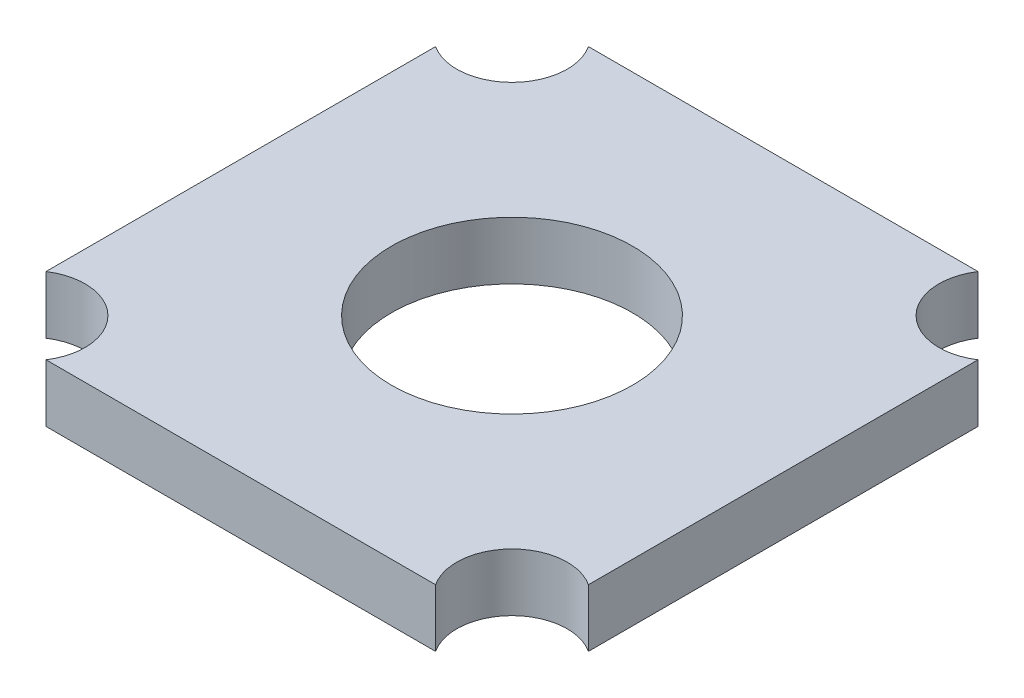
ISO-10303-21;
HEADER;
FILE_DESCRIPTION(('STEP AP214'),'2;1');
FILE_NAME('part.step','',(''),(''),'','','');
FILE_SCHEMA(('AUTOMOTIVE_DESIGN { 1 0 10303 214 1 1 1 1 }'));
ENDSEC;
DATA;
#1=APPLICATION_CONTEXT('core data for automotive mechanical design processes');
#2=APPLICATION_PROTOCOL_DEFINITION('international standard','automotive_design',2000,#1);
#3=PRODUCT_CONTEXT('',#1,'mechanical');
#4=PRODUCT('Part','Part','',(#3));
#5=PRODUCT_RELATED_PRODUCT_CATEGORY('part','',(#4));
#6=PRODUCT_DEFINITION_FORMATION('','',#4);
#7=PRODUCT_DEFINITION_CONTEXT('part definition',#1,'design');
#8=PRODUCT_DEFINITION('design','',#6,#7);
#9=PRODUCT_DEFINITION_SHAPE('','',#8);
#10=(LENGTH_UNIT() NAMED_UNIT(*) SI_UNIT(.MILLI.,.METRE.));
#11=(NAMED_UNIT(*) PLANE_ANGLE_UNIT() SI_UNIT($,.RADIAN.));
#12=(NAMED_UNIT(*) SI_UNIT($,.STERADIAN.) SOLID_ANGLE_UNIT());
#13=UNCERTAINTY_MEASURE_WITH_UNIT(LENGTH_MEASURE(1.E-05),#10,'distance_accuracy_value','');
#14=(GEOMETRIC_REPRESENTATION_CONTEXT(3) GLOBAL_UNCERTAINTY_ASSIGNED_CONTEXT((#13)) GLOBAL_UNIT_ASSIGNED_CONTEXT((#10,
#11,#12)) REPRESENTATION_CONTEXT('',''));
#15=CARTESIAN_POINT('',(0.,0.,0.));
#16=DIRECTION('',(0.,0.,1.));
#17=DIRECTION('',(1.,0.,0.));
#18=AXIS2_PLACEMENT_3D('',#15,#16,#17);
#19=CARTESIAN_POINT('',(85.725,18.25625,85.725));
#20=DIRECTION('',(-1.,0.,0.));
#21=DIRECTION('',(0.,0.,1.));
#22=AXIS2_PLACEMENT_3D('',#19,#20,#21);
#23=PLANE('',#22);
#24=DIRECTION('',(0.,0.,-1.));
#25=VECTOR('',#24,1.);
#26=CARTESIAN_POINT('',(85.725,18.25625,85.725));
#27=LINE('',#26,#25);
#28=CARTESIAN_POINT('',(85.725,18.25625,61.5639731740475));
#29=VERTEX_POINT('',#28);
#30=CARTESIAN_POINT('',(85.725,18.25625,-61.5639731740476));
#31=VERTEX_POINT('',#30);
#32=EDGE_CURVE('E129',#29,#31,#27,.T.);
#33=ORIENTED_EDGE('',*,*,#32,.F.);
#34=DIRECTION('',(0.,1.,0.));
#35=VECTOR('',#34,1.);
#36=CARTESIAN_POINT('',(85.725,0.,61.5639731740475));
#37=LINE('',#36,#35);
#38=CARTESIAN_POINT('',(85.725,0.,61.5639731740475));
#39=VERTEX_POINT('',#38);
#40=EDGE_CURVE('E148',#29,#39,#37,.F.);
#41=ORIENTED_EDGE('',*,*,#40,.T.);
#42=DIRECTION('',(0.,0.,-1.));
#43=VECTOR('',#42,1.);
#44=CARTESIAN_POINT('',(85.725,0.,85.725));
#45=LINE('',#44,#43);
#46=CARTESIAN_POINT('',(85.725,0.,-61.5639731740476));
#47=VERTEX_POINT('',#46);
#48=EDGE_CURVE('E131',#39,#47,#45,.T.);
#49=ORIENTED_EDGE('',*,*,#48,.T.);
#50=DIRECTION('',(0.,1.,0.));
#51=VECTOR('',#50,1.);
#52=CARTESIAN_POINT('',(85.725,0.,-61.5639731740476));
#53=LINE('',#52,#51);
#54=EDGE_CURVE('E154',#47,#31,#53,.T.);
#55=ORIENTED_EDGE('',*,*,#54,.T.);
#56=EDGE_LOOP('',(#33,#41,#49,#55));
#57=FACE_BOUND('',#56,.T.);
#58=ADVANCED_FACE('F44',(#57),#23,.F.);
#59=CARTESIAN_POINT('',(-85.725,18.25625,-85.725));
#60=DIRECTION('',(0.,0.,1.));
#61=DIRECTION('',(1.,0.,0.));
#62=AXIS2_PLACEMENT_3D('',#59,#60,#61);
#63=PLANE('',#62);
#64=DIRECTION('',(-1.,0.,0.));
#65=VECTOR('',#64,1.);
#66=CARTESIAN_POINT('',(-85.725,18.25625,-85.725));
#67=LINE('',#66,#65);
#68=CARTESIAN_POINT('',(61.5639731740475,18.25625,-85.725));
#69=VERTEX_POINT('',#68);
#70=CARTESIAN_POINT('',(-61.5639731740476,18.25625,-85.725));
#71=VERTEX_POINT('',#70);
#72=EDGE_CURVE('E139',#69,#71,#67,.T.);
#73=ORIENTED_EDGE('',*,*,#72,.F.);
#74=DIRECTION('',(0.,1.,0.));
#75=VECTOR('',#74,1.);
#76=CARTESIAN_POINT('',(61.5639731740475,0.,-85.725));
#77=LINE('',#76,#75);
#78=CARTESIAN_POINT('',(61.5639731740475,0.,-85.725));
#79=VERTEX_POINT('',#78);
#80=EDGE_CURVE('E157',#69,#79,#77,.F.);
#81=ORIENTED_EDGE('',*,*,#80,.T.);
#82=DIRECTION('',(-1.,0.,0.));
#83=VECTOR('',#82,1.);
#84=CARTESIAN_POINT('',(-85.725,0.,-85.725));
#85=LINE('',#84,#83);
#86=CARTESIAN_POINT('',(-61.5639731740476,0.,-85.725));
#87=VERTEX_POINT('',#86);
#88=EDGE_CURVE('E126',#79,#87,#85,.T.);
#89=ORIENTED_EDGE('',*,*,#88,.T.);
#90=DIRECTION('',(0.,1.,0.));
#91=VECTOR('',#90,1.);
#92=CARTESIAN_POINT('',(-61.5639731740476,0.,-85.725));
#93=LINE('',#92,#91);
#94=EDGE_CURVE('E58',#87,#71,#93,.T.);
#95=ORIENTED_EDGE('',*,*,#94,.T.);
#96=EDGE_LOOP('',(#73,#81,#89,#95));
#97=FACE_BOUND('',#96,.T.);
#98=ADVANCED_FACE('F197',(#97),#63,.F.);
#99=CARTESIAN_POINT('',(-85.725,18.25625,85.725));
#100=DIRECTION('',(1.,0.,0.));
#101=DIRECTION('',(0.,0.,-1.));
#102=AXIS2_PLACEMENT_3D('',#99,#100,#101);
#103=PLANE('',#102);
#104=DIRECTION('',(0.,0.,1.));
#105=VECTOR('',#104,1.);
#106=CARTESIAN_POINT('',(-85.725,0.,85.725));
#107=LINE('',#106,#105);
#108=CARTESIAN_POINT('',(-85.725,0.,-61.5639731740475));
#109=VERTEX_POINT('',#108);
#110=CARTESIAN_POINT('',(-85.725,0.,61.5639731740475));
#111=VERTEX_POINT('',#110);
#112=EDGE_CURVE('E117',#109,#111,#107,.T.);
#113=ORIENTED_EDGE('',*,*,#112,.T.);
#114=DIRECTION('',(0.,1.,0.));
#115=VECTOR('',#114,1.);
#116=CARTESIAN_POINT('',(-85.725,0.,61.5639731740475));
#117=LINE('',#116,#115);
#118=CARTESIAN_POINT('',(-85.725,18.25625,61.5639731740475));
#119=VERTEX_POINT('',#118);
#120=EDGE_CURVE('E66',#111,#119,#117,.T.);
#121=ORIENTED_EDGE('',*,*,#120,.T.);
#122=DIRECTION('',(0.,0.,1.));
#123=VECTOR('',#122,1.);
#124=CARTESIAN_POINT('',(-85.725,18.25625,85.725));
#125=LINE('',#124,#123);
#126=CARTESIAN_POINT('',(-85.725,18.25625,-61.5639731740475));
#127=VERTEX_POINT('',#126);
#128=EDGE_CURVE('E119',#127,#119,#125,.T.);
#129=ORIENTED_EDGE('',*,*,#128,.F.);
#130=DIRECTION('',(0.,1.,0.));
#131=VECTOR('',#130,1.);
#132=CARTESIAN_POINT('',(-85.725,0.,-61.5639731740475));
#133=LINE('',#132,#131);
#134=EDGE_CURVE('E106',#127,#109,#133,.F.);
#135=ORIENTED_EDGE('',*,*,#134,.T.);
#136=EDGE_LOOP('',(#113,#121,#129,#135));
#137=FACE_BOUND('',#136,.T.);
#138=ADVANCED_FACE('F116',(#137),#103,.F.);
#139=CARTESIAN_POINT('',(-85.725,18.25625,85.725));
#140=DIRECTION('',(0.,0.,-1.));
#141=DIRECTION('',(-1.,0.,0.));
#142=AXIS2_PLACEMENT_3D('',#139,#140,#141);
#143=PLANE('',#142);
#144=DIRECTION('',(1.,0.,0.));
#145=VECTOR('',#144,1.);
#146=CARTESIAN_POINT('',(-85.725,18.25625,85.725));
#147=LINE('',#146,#145);
#148=CARTESIAN_POINT('',(-61.5639731740475,18.25625,85.725));
#149=VERTEX_POINT('',#148);
#150=CARTESIAN_POINT('',(61.5639731740476,18.25625,85.725));
#151=VERTEX_POINT('',#150);
#152=EDGE_CURVE('E112',#149,#151,#147,.T.);
#153=ORIENTED_EDGE('',*,*,#152,.F.);
#154=DIRECTION('',(0.,1.,0.));
#155=VECTOR('',#154,1.);
#156=CARTESIAN_POINT('',(-61.5639731740475,0.,85.725));
#157=LINE('',#156,#155);
#158=CARTESIAN_POINT('',(-61.5639731740475,0.,85.725));
#159=VERTEX_POINT('',#158);
#160=EDGE_CURVE('E145',#149,#159,#157,.F.);
#161=ORIENTED_EDGE('',*,*,#160,.T.);
#162=DIRECTION('',(1.,0.,0.));
#163=VECTOR('',#162,1.);
#164=CARTESIAN_POINT('',(-85.725,0.,85.725));
#165=LINE('',#164,#163);
#166=CARTESIAN_POINT('',(61.5639731740476,0.,85.725));
#167=VERTEX_POINT('',#166);
#168=EDGE_CURVE('E125',#159,#167,#165,.T.);
#169=ORIENTED_EDGE('',*,*,#168,.T.);
#170=DIRECTION('',(0.,1.,0.));
#171=VECTOR('',#170,1.);
#172=CARTESIAN_POINT('',(61.5639731740476,0.,85.725));
#173=LINE('',#172,#171);
#174=EDGE_CURVE('E151',#167,#151,#173,.T.);
#175=ORIENTED_EDGE('',*,*,#174,.T.);
#176=EDGE_LOOP('',(#153,#161,#169,#175));
#177=FACE_BOUND('',#176,.T.);
#178=ADVANCED_FACE('F190',(#177),#143,.F.);
#179=CARTESIAN_POINT('',(0.,18.25625,0.));
#180=DIRECTION('',(0.,-1.,0.));
#181=DIRECTION('',(0.,0.,-1.));
#182=AXIS2_PLACEMENT_3D('',#179,#180,#181);
#183=PLANE('',#182);
#184=CARTESIAN_POINT('',(0.,18.25625,0.));
#185=DIRECTION('',(0.,1.,0.));
#186=DIRECTION('',(0.,0.,1.));
#187=AXIS2_PLACEMENT_3D('',#184,#185,#186);
#188=CIRCLE('',#187,38.1);
#189=CARTESIAN_POINT('',(0.,18.25625,38.1));
#190=VERTEX_POINT('',#189);
#191=EDGE_CURVE('E173',#190,#190,#188,.T.);
#192=ORIENTED_EDGE('',*,*,#191,.F.);
#193=EDGE_LOOP('',(#192));
#194=FACE_BOUND('',#193,.T.);
#195=ORIENTED_EDGE('',*,*,#128,.T.);
#196=CARTESIAN_POINT('',(-76.2,18.25625,76.2));
#197=DIRECTION('',(0.,1.,0.));
#198=DIRECTION('',(0.,0.,1.));
#199=AXIS2_PLACEMENT_3D('',#196,#197,#198);
#200=CIRCLE('',#199,17.4625);
#201=EDGE_CURVE('E163',#149,#119,#200,.T.);
#202=ORIENTED_EDGE('',*,*,#201,.F.);
#203=ORIENTED_EDGE('',*,*,#152,.T.);
#204=CARTESIAN_POINT('',(76.2,18.25625,76.2));
#205=DIRECTION('',(0.,1.,0.));
#206=DIRECTION('',(0.,0.,1.));
#207=AXIS2_PLACEMENT_3D('',#204,#205,#206);
#208=CIRCLE('',#207,17.4625);
#209=EDGE_CURVE('E167',#29,#151,#208,.T.);
#210=ORIENTED_EDGE('',*,*,#209,.F.);
#211=ORIENTED_EDGE('',*,*,#32,.T.);
#212=CARTESIAN_POINT('',(76.2,18.25625,-76.2));
#213=DIRECTION('',(0.,1.,0.));
#214=DIRECTION('',(0.,0.,1.));
#215=AXIS2_PLACEMENT_3D('',#212,#213,#214);
#216=CIRCLE('',#215,17.4625);
#217=EDGE_CURVE('E162',#69,#31,#216,.T.);
#218=ORIENTED_EDGE('',*,*,#217,.F.);
#219=ORIENTED_EDGE('',*,*,#72,.T.);
#220=CARTESIAN_POINT('',(-76.2,18.25625,-76.2));
#221=DIRECTION('',(0.,1.,0.));
#222=DIRECTION('',(0.,0.,1.));
#223=AXIS2_PLACEMENT_3D('',#220,#221,#222);
#224=CIRCLE('',#223,17.4625);
#225=EDGE_CURVE('E120',#127,#71,#224,.T.);
#226=ORIENTED_EDGE('',*,*,#225,.F.);
#227=EDGE_LOOP('',(#195,#202,#203,#210,#211,#218,#219,#226));
#228=FACE_BOUND('',#227,.T.);
#229=ADVANCED_FACE('F187',(#194,#228),#183,.F.);
#230=CARTESIAN_POINT('',(0.,0.,0.));
#231=DIRECTION('',(0.,-1.,0.));
#232=DIRECTION('',(0.,0.,-1.));
#233=AXIS2_PLACEMENT_3D('',#230,#231,#232);
#234=PLANE('',#233);
#235=CARTESIAN_POINT('',(0.,0.,0.));
#236=DIRECTION('',(0.,1.,0.));
#237=DIRECTION('',(0.,0.,1.));
#238=AXIS2_PLACEMENT_3D('',#235,#236,#237);
#239=CIRCLE('',#238,38.1);
#240=CARTESIAN_POINT('',(0.,0.,38.1));
#241=VERTEX_POINT('',#240);
#242=EDGE_CURVE('E165',#241,#241,#239,.T.);
#243=ORIENTED_EDGE('',*,*,#242,.T.);
#244=EDGE_LOOP('',(#243));
#245=FACE_BOUND('',#244,.T.);
#246=CARTESIAN_POINT('',(-76.2,0.,76.2));
#247=DIRECTION('',(0.,1.,0.));
#248=DIRECTION('',(0.,0.,1.));
#249=AXIS2_PLACEMENT_3D('',#246,#247,#248);
#250=CIRCLE('',#249,17.4625);
#251=EDGE_CURVE('E124',#159,#111,#250,.T.);
#252=ORIENTED_EDGE('',*,*,#251,.T.);
#253=ORIENTED_EDGE('',*,*,#112,.F.);
#254=CARTESIAN_POINT('',(-76.2,0.,-76.2));
#255=DIRECTION('',(0.,-1.,0.));
#256=DIRECTION('',(0.,0.,-1.));
#257=AXIS2_PLACEMENT_3D('',#254,#255,#256);
#258=CIRCLE('',#257,17.4625);
#259=EDGE_CURVE('E51',#87,#109,#258,.T.);
#260=ORIENTED_EDGE('',*,*,#259,.F.);
#261=ORIENTED_EDGE('',*,*,#88,.F.);
#262=CARTESIAN_POINT('',(76.2,0.,-76.2));
#263=DIRECTION('',(0.,-1.,0.));
#264=DIRECTION('',(0.,0.,-1.));
#265=AXIS2_PLACEMENT_3D('',#262,#263,#264);
#266=CIRCLE('',#265,17.4625);
#267=EDGE_CURVE('E13',#47,#79,#266,.T.);
#268=ORIENTED_EDGE('',*,*,#267,.F.);
#269=ORIENTED_EDGE('',*,*,#48,.F.);
#270=CARTESIAN_POINT('',(76.2,0.,76.2));
#271=DIRECTION('',(0.,1.,0.));
#272=DIRECTION('',(0.,0.,1.));
#273=AXIS2_PLACEMENT_3D('',#270,#271,#272);
#274=CIRCLE('',#273,17.4625);
#275=EDGE_CURVE('E169',#39,#167,#274,.T.);
#276=ORIENTED_EDGE('',*,*,#275,.T.);
#277=ORIENTED_EDGE('',*,*,#168,.F.);
#278=EDGE_LOOP('',(#252,#253,#260,#261,#268,#269,#276,#277));
#279=FACE_BOUND('',#278,.T.);
#280=ADVANCED_FACE('F122',(#245,#279),#234,.T.);
#281=CARTESIAN_POINT('',(-76.2,0.,-76.2));
#282=DIRECTION('',(0.,1.,0.));
#283=DIRECTION('',(0.,0.,1.));
#284=AXIS2_PLACEMENT_3D('',#281,#282,#283);
#285=CYLINDRICAL_SURFACE('',#284,17.4625);
#286=ORIENTED_EDGE('',*,*,#259,.T.);
#287=ORIENTED_EDGE('',*,*,#134,.F.);
#288=ORIENTED_EDGE('',*,*,#225,.T.);
#289=ORIENTED_EDGE('',*,*,#94,.F.);
#290=EDGE_LOOP('',(#286,#287,#288,#289));
#291=FACE_BOUND('',#290,.T.);
#292=ADVANCED_FACE('F105',(#291),#285,.F.);
#293=CARTESIAN_POINT('',(76.2,0.,-76.2));
#294=DIRECTION('',(0.,1.,0.));
#295=DIRECTION('',(0.,0.,1.));
#296=AXIS2_PLACEMENT_3D('',#293,#294,#295);
#297=CYLINDRICAL_SURFACE('',#296,17.4625);
#298=ORIENTED_EDGE('',*,*,#267,.T.);
#299=ORIENTED_EDGE('',*,*,#80,.F.);
#300=ORIENTED_EDGE('',*,*,#217,.T.);
#301=ORIENTED_EDGE('',*,*,#54,.F.);
#302=EDGE_LOOP('',(#298,#299,#300,#301));
#303=FACE_BOUND('',#302,.T.);
#304=ADVANCED_FACE('F212',(#303),#297,.F.);
#305=CARTESIAN_POINT('',(76.2,0.,76.2));
#306=DIRECTION('',(0.,1.,0.));
#307=DIRECTION('',(0.,0.,1.));
#308=AXIS2_PLACEMENT_3D('',#305,#306,#307);
#309=CYLINDRICAL_SURFACE('',#308,17.4625);
#310=ORIENTED_EDGE('',*,*,#209,.T.);
#311=ORIENTED_EDGE('',*,*,#174,.F.);
#312=ORIENTED_EDGE('',*,*,#275,.F.);
#313=ORIENTED_EDGE('',*,*,#40,.F.);
#314=EDGE_LOOP('',(#310,#311,#312,#313));
#315=FACE_BOUND('',#314,.T.);
#316=ADVANCED_FACE('F205',(#315),#309,.F.);
#317=CARTESIAN_POINT('',(-76.2,0.,76.2));
#318=DIRECTION('',(0.,1.,0.));
#319=DIRECTION('',(0.,0.,1.));
#320=AXIS2_PLACEMENT_3D('',#317,#318,#319);
#321=CYLINDRICAL_SURFACE('',#320,17.4625);
#322=ORIENTED_EDGE('',*,*,#251,.F.);
#323=ORIENTED_EDGE('',*,*,#160,.F.);
#324=ORIENTED_EDGE('',*,*,#201,.T.);
#325=ORIENTED_EDGE('',*,*,#120,.F.);
#326=EDGE_LOOP('',(#322,#323,#324,#325));
#327=FACE_BOUND('',#326,.T.);
#328=ADVANCED_FACE('F183',(#327),#321,.F.);
#329=CARTESIAN_POINT('',(0.,0.,0.));
#330=DIRECTION('',(0.,1.,0.));
#331=DIRECTION('',(0.,0.,1.));
#332=AXIS2_PLACEMENT_3D('',#329,#330,#331);
#333=CYLINDRICAL_SURFACE('',#332,38.1);
#334=ORIENTED_EDGE('',*,*,#242,.F.);
#335=EDGE_LOOP('',(#334));
#336=FACE_BOUND('',#335,.T.);
#337=ORIENTED_EDGE('',*,*,#191,.T.);
#338=EDGE_LOOP('',(#337));
#339=FACE_BOUND('',#338,.T.);
#340=ADVANCED_FACE('F180',(#336,#339),#333,.F.);
#341=CLOSED_SHELL('',(#58,#98,#138,#178,#229,#280,#292,#304,#316,#328,#340));
#342=MANIFOLD_SOLID_BREP('B2',#341);
#343=ADVANCED_BREP_SHAPE_REPRESENTATION('',(#18,#342),#14);
#344=SHAPE_DEFINITION_REPRESENTATION(#9,#343);
ENDSEC;
END-ISO-10303-21;
